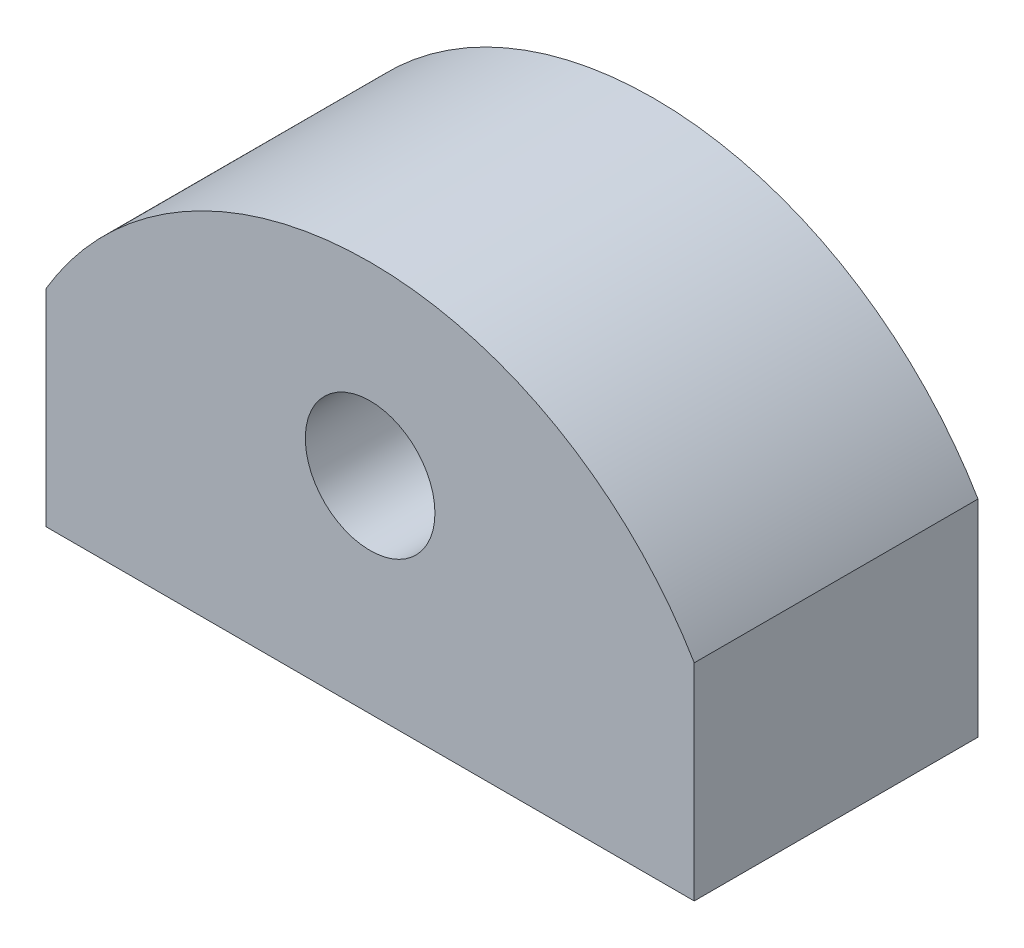
ISO-10303-21;
HEADER;
FILE_DESCRIPTION(('STEP AP214'),'2;1');
FILE_NAME('part.step','',(''),(''),'','','');
FILE_SCHEMA(('AUTOMOTIVE_DESIGN { 1 0 10303 214 1 1 1 1 }'));
ENDSEC;
DATA;
#1=APPLICATION_CONTEXT('core data for automotive mechanical design processes');
#2=APPLICATION_PROTOCOL_DEFINITION('international standard','automotive_design',2000,#1);
#3=PRODUCT_CONTEXT('',#1,'mechanical');
#4=PRODUCT('Part','Part','',(#3));
#5=PRODUCT_RELATED_PRODUCT_CATEGORY('part','',(#4));
#6=PRODUCT_DEFINITION_FORMATION('','',#4);
#7=PRODUCT_DEFINITION_CONTEXT('part definition',#1,'design');
#8=PRODUCT_DEFINITION('design','',#6,#7);
#9=PRODUCT_DEFINITION_SHAPE('','',#8);
#10=(LENGTH_UNIT() NAMED_UNIT(*) SI_UNIT(.MILLI.,.METRE.));
#11=(NAMED_UNIT(*) PLANE_ANGLE_UNIT() SI_UNIT($,.RADIAN.));
#12=(NAMED_UNIT(*) SI_UNIT($,.STERADIAN.) SOLID_ANGLE_UNIT());
#13=UNCERTAINTY_MEASURE_WITH_UNIT(LENGTH_MEASURE(1.E-05),#10,'distance_accuracy_value','');
#14=(GEOMETRIC_REPRESENTATION_CONTEXT(3) GLOBAL_UNCERTAINTY_ASSIGNED_CONTEXT((#13)) GLOBAL_UNIT_ASSIGNED_CONTEXT((#10,
#11,#12)) REPRESENTATION_CONTEXT('',''));
#15=CARTESIAN_POINT('',(0.,0.,0.));
#16=DIRECTION('',(0.,0.,1.));
#17=DIRECTION('',(1.,0.,0.));
#18=AXIS2_PLACEMENT_3D('',#15,#16,#17);
#19=CARTESIAN_POINT('',(11.,3.5,9.63));
#20=DIRECTION('',(-1.,0.,0.));
#21=DIRECTION('',(0.,0.,1.));
#22=AXIS2_PLACEMENT_3D('',#19,#20,#21);
#23=PLANE('',#22);
#24=DIRECTION('',(0.,1.,0.));
#25=VECTOR('',#24,1.);
#26=CARTESIAN_POINT('',(11.,3.5,0.));
#27=LINE('',#26,#25);
#28=CARTESIAN_POINT('',(11.,-3.5,0.));
#29=VERTEX_POINT('',#28);
#30=CARTESIAN_POINT('',(11.,3.5,0.));
#31=VERTEX_POINT('',#30);
#32=EDGE_CURVE('E95',#29,#31,#27,.T.);
#33=ORIENTED_EDGE('',*,*,#32,.T.);
#34=DIRECTION('',(0.,0.,-1.));
#35=VECTOR('',#34,1.);
#36=CARTESIAN_POINT('',(11.,3.5,9.63));
#37=LINE('',#36,#35);
#38=CARTESIAN_POINT('',(11.,3.5,9.63));
#39=VERTEX_POINT('',#38);
#40=EDGE_CURVE('E11',#39,#31,#37,.T.);
#41=ORIENTED_EDGE('',*,*,#40,.F.);
#42=DIRECTION('',(0.,1.,0.));
#43=VECTOR('',#42,1.);
#44=CARTESIAN_POINT('',(11.,3.5,9.63));
#45=LINE('',#44,#43);
#46=CARTESIAN_POINT('',(11.,-3.5,9.63));
#47=VERTEX_POINT('',#46);
#48=EDGE_CURVE('E83',#47,#39,#45,.T.);
#49=ORIENTED_EDGE('',*,*,#48,.F.);
#50=DIRECTION('',(0.,0.,-1.));
#51=VECTOR('',#50,1.);
#52=CARTESIAN_POINT('',(11.,-3.5,9.63));
#53=LINE('',#52,#51);
#54=EDGE_CURVE('E91',#47,#29,#53,.T.);
#55=ORIENTED_EDGE('',*,*,#54,.T.);
#56=EDGE_LOOP('',(#33,#41,#49,#55));
#57=FACE_BOUND('',#56,.T.);
#58=ADVANCED_FACE('F32',(#57),#23,.F.);
#59=CARTESIAN_POINT('',(0.,-3.,9.63));
#60=DIRECTION('',(0.,0.,-1.));
#61=DIRECTION('',(-1.,0.,0.));
#62=AXIS2_PLACEMENT_3D('',#59,#60,#61);
#63=CYLINDRICAL_SURFACE('',#62,12.7769323391806);
#64=CARTESIAN_POINT('',(0.,-3.,0.));
#65=DIRECTION('',(0.,0.,1.));
#66=DIRECTION('',(-1.,0.,0.));
#67=AXIS2_PLACEMENT_3D('',#64,#65,#66);
#68=CIRCLE('',#67,12.7769323391806);
#69=CARTESIAN_POINT('',(-11.,3.5,0.));
#70=VERTEX_POINT('',#69);
#71=EDGE_CURVE('E87',#31,#70,#68,.T.);
#72=ORIENTED_EDGE('',*,*,#71,.T.);
#73=DIRECTION('',(0.,0.,-1.));
#74=VECTOR('',#73,1.);
#75=CARTESIAN_POINT('',(-11.,3.5,9.63));
#76=LINE('',#75,#74);
#77=CARTESIAN_POINT('',(-11.,3.5,9.63));
#78=VERTEX_POINT('',#77);
#79=EDGE_CURVE('E40',#78,#70,#76,.T.);
#80=ORIENTED_EDGE('',*,*,#79,.F.);
#81=CARTESIAN_POINT('',(0.,-3.,9.63));
#82=DIRECTION('',(0.,0.,1.));
#83=DIRECTION('',(-1.,0.,0.));
#84=AXIS2_PLACEMENT_3D('',#81,#82,#83);
#85=CIRCLE('',#84,12.7769323391806);
#86=EDGE_CURVE('E78',#39,#78,#85,.T.);
#87=ORIENTED_EDGE('',*,*,#86,.F.);
#88=ORIENTED_EDGE('',*,*,#40,.T.);
#89=EDGE_LOOP('',(#72,#80,#87,#88));
#90=FACE_BOUND('',#89,.T.);
#91=ADVANCED_FACE('F86',(#90),#63,.T.);
#92=CARTESIAN_POINT('',(-11.,3.5,9.63));
#93=DIRECTION('',(1.,0.,0.));
#94=DIRECTION('',(0.,0.,-1.));
#95=AXIS2_PLACEMENT_3D('',#92,#93,#94);
#96=PLANE('',#95);
#97=DIRECTION('',(0.,-1.,0.));
#98=VECTOR('',#97,1.);
#99=CARTESIAN_POINT('',(-11.,3.5,0.));
#100=LINE('',#99,#98);
#101=CARTESIAN_POINT('',(-11.,-3.5,0.));
#102=VERTEX_POINT('',#101);
#103=EDGE_CURVE('E65',#70,#102,#100,.T.);
#104=ORIENTED_EDGE('',*,*,#103,.T.);
#105=DIRECTION('',(0.,0.,-1.));
#106=VECTOR('',#105,1.);
#107=CARTESIAN_POINT('',(-11.,-3.5,9.63));
#108=LINE('',#107,#106);
#109=CARTESIAN_POINT('',(-11.,-3.5,9.63));
#110=VERTEX_POINT('',#109);
#111=EDGE_CURVE('E88',#110,#102,#108,.T.);
#112=ORIENTED_EDGE('',*,*,#111,.F.);
#113=DIRECTION('',(0.,-1.,0.));
#114=VECTOR('',#113,1.);
#115=CARTESIAN_POINT('',(-11.,3.5,9.63));
#116=LINE('',#115,#114);
#117=EDGE_CURVE('E81',#78,#110,#116,.T.);
#118=ORIENTED_EDGE('',*,*,#117,.F.);
#119=ORIENTED_EDGE('',*,*,#79,.T.);
#120=EDGE_LOOP('',(#104,#112,#118,#119));
#121=FACE_BOUND('',#120,.T.);
#122=ADVANCED_FACE('F89',(#121),#96,.F.);
#123=CARTESIAN_POINT('',(-11.,-3.5,9.63));
#124=DIRECTION('',(0.,1.,0.));
#125=DIRECTION('',(0.,0.,1.));
#126=AXIS2_PLACEMENT_3D('',#123,#124,#125);
#127=PLANE('',#126);
#128=CARTESIAN_POINT('',(-6.,-3.5,4.815));
#129=DIRECTION('',(0.,-1.,0.));
#130=DIRECTION('',(0.,0.,-1.));
#131=AXIS2_PLACEMENT_3D('',#128,#129,#130);
#132=CIRCLE('',#131,1.75);
#133=CARTESIAN_POINT('',(-6.,-3.5,3.065));
#134=VERTEX_POINT('',#133);
#135=EDGE_CURVE('E121',#134,#134,#132,.T.);
#136=ORIENTED_EDGE('',*,*,#135,.F.);
#137=EDGE_LOOP('',(#136));
#138=FACE_BOUND('',#137,.T.);
#139=CARTESIAN_POINT('',(6.,-3.5,4.815));
#140=DIRECTION('',(0.,-1.,0.));
#141=DIRECTION('',(0.,0.,1.));
#142=AXIS2_PLACEMENT_3D('',#139,#140,#141);
#143=CIRCLE('',#142,1.75);
#144=CARTESIAN_POINT('',(6.,-3.5,6.565));
#145=VERTEX_POINT('',#144);
#146=EDGE_CURVE('E115',#145,#145,#143,.T.);
#147=ORIENTED_EDGE('',*,*,#146,.F.);
#148=EDGE_LOOP('',(#147));
#149=FACE_BOUND('',#148,.T.);
#150=DIRECTION('',(1.,0.,0.));
#151=VECTOR('',#150,1.);
#152=CARTESIAN_POINT('',(-11.,-3.5,0.));
#153=LINE('',#152,#151);
#154=EDGE_CURVE('E71',#102,#29,#153,.T.);
#155=ORIENTED_EDGE('',*,*,#154,.T.);
#156=ORIENTED_EDGE('',*,*,#54,.F.);
#157=DIRECTION('',(1.,0.,0.));
#158=VECTOR('',#157,1.);
#159=CARTESIAN_POINT('',(-11.,-3.5,9.63));
#160=LINE('',#159,#158);
#161=EDGE_CURVE('E48',#110,#47,#160,.T.);
#162=ORIENTED_EDGE('',*,*,#161,.F.);
#163=ORIENTED_EDGE('',*,*,#111,.T.);
#164=EDGE_LOOP('',(#155,#156,#162,#163));
#165=FACE_BOUND('',#164,.T.);
#166=ADVANCED_FACE('F103',(#138,#149,#165),#127,.F.);
#167=CARTESIAN_POINT('',(0.,-3.,9.63));
#168=DIRECTION('',(0.,0.,-1.));
#169=DIRECTION('',(-1.,0.,0.));
#170=AXIS2_PLACEMENT_3D('',#167,#168,#169);
#171=PLANE('',#170);
#172=CARTESIAN_POINT('',(0.,3.5,9.63));
#173=DIRECTION('',(0.,0.,1.));
#174=DIRECTION('',(1.,0.,0.));
#175=AXIS2_PLACEMENT_3D('',#172,#173,#174);
#176=CIRCLE('',#175,2.2);
#177=CARTESIAN_POINT('',(2.2,3.5,9.63));
#178=VERTEX_POINT('',#177);
#179=EDGE_CURVE('E111',#178,#178,#176,.T.);
#180=ORIENTED_EDGE('',*,*,#179,.F.);
#181=EDGE_LOOP('',(#180));
#182=FACE_BOUND('',#181,.T.);
#183=ORIENTED_EDGE('',*,*,#48,.T.);
#184=ORIENTED_EDGE('',*,*,#86,.T.);
#185=ORIENTED_EDGE('',*,*,#117,.T.);
#186=ORIENTED_EDGE('',*,*,#161,.T.);
#187=EDGE_LOOP('',(#183,#184,#185,#186));
#188=FACE_BOUND('',#187,.T.);
#189=ADVANCED_FACE('F79',(#182,#188),#171,.F.);
#190=CARTESIAN_POINT('',(0.,-3.,0.));
#191=DIRECTION('',(0.,0.,-1.));
#192=DIRECTION('',(-1.,0.,0.));
#193=AXIS2_PLACEMENT_3D('',#190,#191,#192);
#194=PLANE('',#193);
#195=CARTESIAN_POINT('',(0.,3.5,0.));
#196=DIRECTION('',(0.,0.,-1.));
#197=DIRECTION('',(-1.,0.,0.));
#198=AXIS2_PLACEMENT_3D('',#195,#196,#197);
#199=CIRCLE('',#198,2.2);
#200=CARTESIAN_POINT('',(-2.2,3.5,0.));
#201=VERTEX_POINT('',#200);
#202=EDGE_CURVE('E98',#201,#201,#199,.F.);
#203=ORIENTED_EDGE('',*,*,#202,.T.);
#204=EDGE_LOOP('',(#203));
#205=FACE_BOUND('',#204,.T.);
#206=ORIENTED_EDGE('',*,*,#32,.F.);
#207=ORIENTED_EDGE('',*,*,#154,.F.);
#208=ORIENTED_EDGE('',*,*,#103,.F.);
#209=ORIENTED_EDGE('',*,*,#71,.F.);
#210=EDGE_LOOP('',(#206,#207,#208,#209));
#211=FACE_BOUND('',#210,.T.);
#212=ADVANCED_FACE('F106',(#205,#211),#194,.T.);
#213=CARTESIAN_POINT('',(0.,3.5,-6.22253967444162));
#214=DIRECTION('',(0.,0.,1.));
#215=DIRECTION('',(1.,0.,0.));
#216=AXIS2_PLACEMENT_3D('',#213,#214,#215);
#217=CYLINDRICAL_SURFACE('',#216,2.2);
#218=ORIENTED_EDGE('',*,*,#179,.T.);
#219=EDGE_LOOP('',(#218));
#220=FACE_BOUND('',#219,.T.);
#221=ORIENTED_EDGE('',*,*,#202,.F.);
#222=EDGE_LOOP('',(#221));
#223=FACE_BOUND('',#222,.T.);
#224=ADVANCED_FACE('F143',(#220,#223),#217,.F.);
#225=CARTESIAN_POINT('',(6.,4.5,4.815));
#226=DIRECTION('',(0.,-1.,0.));
#227=DIRECTION('',(0.,0.,-1.));
#228=AXIS2_PLACEMENT_3D('',#225,#226,#227);
#229=CYLINDRICAL_SURFACE('',#228,1.75);
#230=CARTESIAN_POINT('',(6.,4.5,4.815));
#231=DIRECTION('',(0.,-1.,0.));
#232=DIRECTION('',(0.,0.,1.));
#233=AXIS2_PLACEMENT_3D('',#230,#231,#232);
#234=CIRCLE('',#233,1.75);
#235=CARTESIAN_POINT('',(6.,4.5,6.565));
#236=VERTEX_POINT('',#235);
#237=EDGE_CURVE('E118',#236,#236,#234,.T.);
#238=ORIENTED_EDGE('',*,*,#237,.F.);
#239=EDGE_LOOP('',(#238));
#240=FACE_BOUND('',#239,.T.);
#241=ORIENTED_EDGE('',*,*,#146,.T.);
#242=EDGE_LOOP('',(#241));
#243=FACE_BOUND('',#242,.T.);
#244=ADVANCED_FACE('F141',(#240,#243),#229,.F.);
#245=CARTESIAN_POINT('',(6.,4.5,4.815));
#246=DIRECTION('',(0.,1.,0.));
#247=DIRECTION('',(0.,0.,1.));
#248=AXIS2_PLACEMENT_3D('',#245,#246,#247);
#249=PLANE('',#248);
#250=ORIENTED_EDGE('',*,*,#237,.T.);
#251=EDGE_LOOP('',(#250));
#252=FACE_BOUND('',#251,.T.);
#253=ADVANCED_FACE('F132',(#252),#249,.F.);
#254=CARTESIAN_POINT('',(-6.,4.5,4.815));
#255=DIRECTION('',(0.,-1.,0.));
#256=DIRECTION('',(0.,0.,-1.));
#257=AXIS2_PLACEMENT_3D('',#254,#255,#256);
#258=CYLINDRICAL_SURFACE('',#257,1.75);
#259=CARTESIAN_POINT('',(-6.,4.5,4.815));
#260=DIRECTION('',(0.,-1.,0.));
#261=DIRECTION('',(0.,0.,-1.));
#262=AXIS2_PLACEMENT_3D('',#259,#260,#261);
#263=CIRCLE('',#262,1.75);
#264=CARTESIAN_POINT('',(-6.,4.5,3.065));
#265=VERTEX_POINT('',#264);
#266=EDGE_CURVE('E114',#265,#265,#263,.T.);
#267=ORIENTED_EDGE('',*,*,#266,.F.);
#268=EDGE_LOOP('',(#267));
#269=FACE_BOUND('',#268,.T.);
#270=ORIENTED_EDGE('',*,*,#135,.T.);
#271=EDGE_LOOP('',(#270));
#272=FACE_BOUND('',#271,.T.);
#273=ADVANCED_FACE('F129',(#269,#272),#258,.F.);
#274=CARTESIAN_POINT('',(-6.,4.5,4.815));
#275=DIRECTION('',(0.,-1.,0.));
#276=DIRECTION('',(0.,0.,-1.));
#277=AXIS2_PLACEMENT_3D('',#274,#275,#276);
#278=PLANE('',#277);
#279=ORIENTED_EDGE('',*,*,#266,.T.);
#280=EDGE_LOOP('',(#279));
#281=FACE_BOUND('',#280,.T.);
#282=ADVANCED_FACE('F127',(#281),#278,.T.);
#283=CLOSED_SHELL('',(#58,#91,#122,#166,#189,#212,#224,#244,#253,#273,#282));
#284=MANIFOLD_SOLID_BREP('B2',#283);
#285=ADVANCED_BREP_SHAPE_REPRESENTATION('',(#18,#284),#14);
#286=SHAPE_DEFINITION_REPRESENTATION(#9,#285);
ENDSEC;
END-ISO-10303-21;
